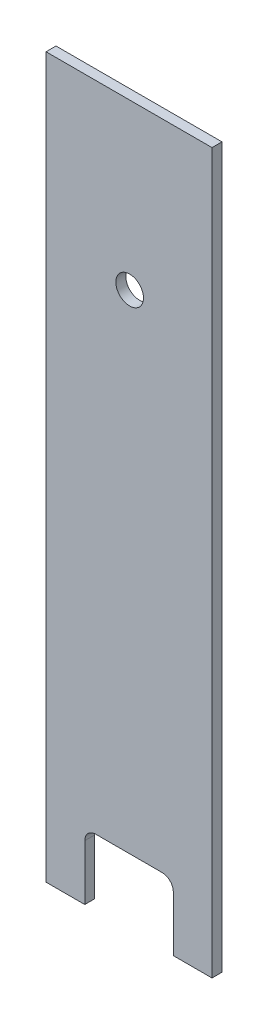
ISO-10303-21;
HEADER;
FILE_DESCRIPTION(('STEP AP214'),'2;1');
FILE_NAME('part.step','',(''),(''),'','','');
FILE_SCHEMA(('AUTOMOTIVE_DESIGN { 1 0 10303 214 1 1 1 1 }'));
ENDSEC;
DATA;
#1=APPLICATION_CONTEXT('core data for automotive mechanical design processes');
#2=APPLICATION_PROTOCOL_DEFINITION('international standard','automotive_design',2000,#1);
#3=PRODUCT_CONTEXT('',#1,'mechanical');
#4=PRODUCT('Part','Part','',(#3));
#5=PRODUCT_RELATED_PRODUCT_CATEGORY('part','',(#4));
#6=PRODUCT_DEFINITION_FORMATION('','',#4);
#7=PRODUCT_DEFINITION_CONTEXT('part definition',#1,'design');
#8=PRODUCT_DEFINITION('design','',#6,#7);
#9=PRODUCT_DEFINITION_SHAPE('','',#8);
#10=(LENGTH_UNIT() NAMED_UNIT(*) SI_UNIT(.MILLI.,.METRE.));
#11=(NAMED_UNIT(*) PLANE_ANGLE_UNIT() SI_UNIT($,.RADIAN.));
#12=(NAMED_UNIT(*) SI_UNIT($,.STERADIAN.) SOLID_ANGLE_UNIT());
#13=UNCERTAINTY_MEASURE_WITH_UNIT(LENGTH_MEASURE(1.E-05),#10,'distance_accuracy_value','');
#14=(GEOMETRIC_REPRESENTATION_CONTEXT(3) GLOBAL_UNCERTAINTY_ASSIGNED_CONTEXT((#13)) GLOBAL_UNIT_ASSIGNED_CONTEXT((#10,
#11,#12)) REPRESENTATION_CONTEXT('',''));
#15=CARTESIAN_POINT('',(0.,0.,0.));
#16=DIRECTION('',(0.,0.,1.));
#17=DIRECTION('',(1.,0.,0.));
#18=AXIS2_PLACEMENT_3D('',#15,#16,#17);
#19=CARTESIAN_POINT('',(-26.6321734476733,-106.380470016207,1.8));
#20=DIRECTION('',(0.,1.,0.));
#21=DIRECTION('',(0.,0.,1.));
#22=AXIS2_PLACEMENT_3D('',#19,#20,#21);
#23=PLANE('',#22);
#24=DIRECTION('',(1.,0.,0.));
#25=VECTOR('',#24,1.);
#26=CARTESIAN_POINT('',(-26.6321734476733,-106.380470016207,0.));
#27=LINE('',#26,#25);
#28=CARTESIAN_POINT('',(-26.6321734476733,-106.380470016207,0.));
#29=VERTEX_POINT('',#28);
#30=CARTESIAN_POINT('',(-19.6321734476733,-106.380470016207,0.));
#31=VERTEX_POINT('',#30);
#32=EDGE_CURVE('E189',#29,#31,#27,.T.);
#33=ORIENTED_EDGE('',*,*,#32,.T.);
#34=DIRECTION('',(0.,0.,-1.));
#35=VECTOR('',#34,1.);
#36=CARTESIAN_POINT('',(-19.6321734476733,-106.380470016207,10.2));
#37=LINE('',#36,#35);
#38=CARTESIAN_POINT('',(-19.6321734476733,-106.380470016207,1.8));
#39=VERTEX_POINT('',#38);
#40=EDGE_CURVE('E156',#39,#31,#37,.T.);
#41=ORIENTED_EDGE('',*,*,#40,.F.);
#42=DIRECTION('',(1.,0.,0.));
#43=VECTOR('',#42,1.);
#44=CARTESIAN_POINT('',(-26.6321734476733,-106.380470016207,1.8));
#45=LINE('',#44,#43);
#46=CARTESIAN_POINT('',(-26.6321734476733,-106.380470016207,1.8));
#47=VERTEX_POINT('',#46);
#48=EDGE_CURVE('E88',#47,#39,#45,.T.);
#49=ORIENTED_EDGE('',*,*,#48,.F.);
#50=DIRECTION('',(0.,0.,-1.));
#51=VECTOR('',#50,1.);
#52=CARTESIAN_POINT('',(-26.6321734476733,-106.380470016207,1.8));
#53=LINE('',#52,#51);
#54=EDGE_CURVE('E11',#47,#29,#53,.T.);
#55=ORIENTED_EDGE('',*,*,#54,.T.);
#56=EDGE_LOOP('',(#33,#41,#49,#55));
#57=FACE_BOUND('',#56,.T.);
#58=ADVANCED_FACE('F36',(#57),#23,.F.);
#59=CARTESIAN_POINT('',(-26.6321734476733,23.6195299837925,1.8));
#60=DIRECTION('',(1.,0.,0.));
#61=DIRECTION('',(0.,0.,-1.));
#62=AXIS2_PLACEMENT_3D('',#59,#60,#61);
#63=PLANE('',#62);
#64=DIRECTION('',(0.,-1.,0.));
#65=VECTOR('',#64,1.);
#66=CARTESIAN_POINT('',(-26.6321734476733,23.6195299837925,0.));
#67=LINE('',#66,#65);
#68=CARTESIAN_POINT('',(-26.6321734476733,23.6195299837925,0.));
#69=VERTEX_POINT('',#68);
#70=EDGE_CURVE('E177',#69,#29,#67,.T.);
#71=ORIENTED_EDGE('',*,*,#70,.T.);
#72=ORIENTED_EDGE('',*,*,#54,.F.);
#73=DIRECTION('',(0.,-1.,0.));
#74=VECTOR('',#73,1.);
#75=CARTESIAN_POINT('',(-26.6321734476733,23.6195299837925,1.8));
#76=LINE('',#75,#74);
#77=CARTESIAN_POINT('',(-26.6321734476733,23.6195299837925,1.8));
#78=VERTEX_POINT('',#77);
#79=EDGE_CURVE('E178',#78,#47,#76,.T.);
#80=ORIENTED_EDGE('',*,*,#79,.F.);
#81=DIRECTION('',(0.,0.,-1.));
#82=VECTOR('',#81,1.);
#83=CARTESIAN_POINT('',(-26.6321734476733,23.6195299837925,1.8));
#84=LINE('',#83,#82);
#85=EDGE_CURVE('E185',#78,#69,#84,.T.);
#86=ORIENTED_EDGE('',*,*,#85,.T.);
#87=EDGE_LOOP('',(#71,#72,#80,#86));
#88=FACE_BOUND('',#87,.T.);
#89=ADVANCED_FACE('F38',(#88),#63,.F.);
#90=CARTESIAN_POINT('',(-3.6321734476733,-106.380470016207,1.8));
#91=VERTEX_POINT('',#90);
#92=CARTESIAN_POINT('',(3.3678265523267,-106.380470016207,1.8));
#93=VERTEX_POINT('',#92);
#94=EDGE_CURVE('E180',#91,#93,#45,.T.);
#95=ORIENTED_EDGE('',*,*,#94,.F.);
#96=DIRECTION('',(0.,0.,-1.));
#97=VECTOR('',#96,1.);
#98=CARTESIAN_POINT('',(-3.6321734476733,-106.380470016207,10.2));
#99=LINE('',#98,#97);
#100=CARTESIAN_POINT('',(-3.6321734476733,-106.380470016207,0.));
#101=VERTEX_POINT('',#100);
#102=EDGE_CURVE('E158',#91,#101,#99,.T.);
#103=ORIENTED_EDGE('',*,*,#102,.T.);
#104=CARTESIAN_POINT('',(3.3678265523267,-106.380470016207,0.));
#105=VERTEX_POINT('',#104);
#106=EDGE_CURVE('E188',#101,#105,#27,.T.);
#107=ORIENTED_EDGE('',*,*,#106,.T.);
#108=DIRECTION('',(0.,0.,-1.));
#109=VECTOR('',#108,1.);
#110=CARTESIAN_POINT('',(3.3678265523267,-106.380470016207,1.8));
#111=LINE('',#110,#109);
#112=EDGE_CURVE('E44',#93,#105,#111,.T.);
#113=ORIENTED_EDGE('',*,*,#112,.F.);
#114=EDGE_LOOP('',(#95,#103,#107,#113));
#115=FACE_BOUND('',#114,.T.);
#116=ADVANCED_FACE('F220',(#115),#23,.F.);
#117=CARTESIAN_POINT('',(3.3678265523267,23.6195299837925,1.8));
#118=DIRECTION('',(-1.,0.,0.));
#119=DIRECTION('',(0.,0.,1.));
#120=AXIS2_PLACEMENT_3D('',#117,#118,#119);
#121=PLANE('',#120);
#122=DIRECTION('',(0.,1.,0.));
#123=VECTOR('',#122,1.);
#124=CARTESIAN_POINT('',(3.3678265523267,23.6195299837925,0.));
#125=LINE('',#124,#123);
#126=CARTESIAN_POINT('',(3.3678265523267,23.6195299837925,0.));
#127=VERTEX_POINT('',#126);
#128=EDGE_CURVE('E192',#105,#127,#125,.T.);
#129=ORIENTED_EDGE('',*,*,#128,.T.);
#130=DIRECTION('',(0.,0.,-1.));
#131=VECTOR('',#130,1.);
#132=CARTESIAN_POINT('',(3.3678265523267,23.6195299837925,1.8));
#133=LINE('',#132,#131);
#134=CARTESIAN_POINT('',(3.3678265523267,23.6195299837925,1.8));
#135=VERTEX_POINT('',#134);
#136=EDGE_CURVE('E196',#135,#127,#133,.T.);
#137=ORIENTED_EDGE('',*,*,#136,.F.);
#138=DIRECTION('',(0.,1.,0.));
#139=VECTOR('',#138,1.);
#140=CARTESIAN_POINT('',(3.3678265523267,23.6195299837925,1.8));
#141=LINE('',#140,#139);
#142=EDGE_CURVE('E182',#93,#135,#141,.T.);
#143=ORIENTED_EDGE('',*,*,#142,.F.);
#144=ORIENTED_EDGE('',*,*,#112,.T.);
#145=EDGE_LOOP('',(#129,#137,#143,#144));
#146=FACE_BOUND('',#145,.T.);
#147=ADVANCED_FACE('F202',(#146),#121,.F.);
#148=CARTESIAN_POINT('',(-26.6321734476733,23.6195299837925,1.8));
#149=DIRECTION('',(0.,-1.,0.));
#150=DIRECTION('',(0.,0.,-1.));
#151=AXIS2_PLACEMENT_3D('',#148,#149,#150);
#152=PLANE('',#151);
#153=DIRECTION('',(-1.,0.,0.));
#154=VECTOR('',#153,1.);
#155=CARTESIAN_POINT('',(-26.6321734476733,23.6195299837925,0.));
#156=LINE('',#155,#154);
#157=EDGE_CURVE('E81',#127,#69,#156,.T.);
#158=ORIENTED_EDGE('',*,*,#157,.T.);
#159=ORIENTED_EDGE('',*,*,#85,.F.);
#160=DIRECTION('',(-1.,0.,0.));
#161=VECTOR('',#160,1.);
#162=CARTESIAN_POINT('',(-26.6321734476733,23.6195299837925,1.8));
#163=LINE('',#162,#161);
#164=EDGE_CURVE('E60',#135,#78,#163,.T.);
#165=ORIENTED_EDGE('',*,*,#164,.F.);
#166=ORIENTED_EDGE('',*,*,#136,.T.);
#167=EDGE_LOOP('',(#158,#159,#165,#166));
#168=FACE_BOUND('',#167,.T.);
#169=ADVANCED_FACE('F211',(#168),#152,.F.);
#170=CARTESIAN_POINT('',(0.,0.,1.8));
#171=DIRECTION('',(0.,0.,1.));
#172=DIRECTION('',(1.,0.,0.));
#173=AXIS2_PLACEMENT_3D('',#170,#171,#172);
#174=PLANE('',#173);
#175=DIRECTION('',(0.,-1.,0.));
#176=VECTOR('',#175,1.);
#177=CARTESIAN_POINT('',(-19.6321734476733,0.,1.8));
#178=LINE('',#177,#176);
#179=CARTESIAN_POINT('',(-19.6321734476733,-96.3804700162075,1.8));
#180=VERTEX_POINT('',#179);
#181=EDGE_CURVE('E167',#180,#39,#178,.T.);
#182=ORIENTED_EDGE('',*,*,#181,.F.);
#183=CARTESIAN_POINT('',(-17.6321734476733,-96.3804700162074,1.8));
#184=DIRECTION('',(0.,0.,1.));
#185=DIRECTION('',(1.,0.,0.));
#186=AXIS2_PLACEMENT_3D('',#183,#184,#185);
#187=CIRCLE('',#186,2.);
#188=CARTESIAN_POINT('',(-17.6321734476733,-94.3804700162074,1.8));
#189=VERTEX_POINT('',#188);
#190=EDGE_CURVE('E169',#189,#180,#187,.T.);
#191=ORIENTED_EDGE('',*,*,#190,.F.);
#192=DIRECTION('',(-1.,0.,0.));
#193=VECTOR('',#192,1.);
#194=CARTESIAN_POINT('',(0.,-94.3804700162074,1.8));
#195=LINE('',#194,#193);
#196=CARTESIAN_POINT('',(-5.63217344767331,-94.3804700162074,1.8));
#197=VERTEX_POINT('',#196);
#198=EDGE_CURVE('E155',#197,#189,#195,.T.);
#199=ORIENTED_EDGE('',*,*,#198,.F.);
#200=CARTESIAN_POINT('',(-5.6321734476733,-96.3804700162074,1.8));
#201=DIRECTION('',(0.,0.,1.));
#202=DIRECTION('',(1.,0.,0.));
#203=AXIS2_PLACEMENT_3D('',#200,#201,#202);
#204=CIRCLE('',#203,2.);
#205=CARTESIAN_POINT('',(-3.6321734476733,-96.3804700162075,1.8));
#206=VERTEX_POINT('',#205);
#207=EDGE_CURVE('E132',#206,#197,#204,.T.);
#208=ORIENTED_EDGE('',*,*,#207,.F.);
#209=DIRECTION('',(0.,1.,0.));
#210=VECTOR('',#209,1.);
#211=CARTESIAN_POINT('',(-3.6321734476733,0.,1.8));
#212=LINE('',#211,#210);
#213=EDGE_CURVE('E165',#91,#206,#212,.T.);
#214=ORIENTED_EDGE('',*,*,#213,.F.);
#215=ORIENTED_EDGE('',*,*,#94,.T.);
#216=ORIENTED_EDGE('',*,*,#142,.T.);
#217=ORIENTED_EDGE('',*,*,#164,.T.);
#218=ORIENTED_EDGE('',*,*,#79,.T.);
#219=ORIENTED_EDGE('',*,*,#48,.T.);
#220=EDGE_LOOP('',(#182,#191,#199,#208,#214,#215,#216,#217,#218,#219));
#221=FACE_BOUND('',#220,.T.);
#222=CARTESIAN_POINT('',(-11.5176619183295,-6.12639899624767,1.8));
#223=DIRECTION('',(0.,0.,1.));
#224=DIRECTION('',(1.,0.,0.));
#225=AXIS2_PLACEMENT_3D('',#222,#223,#224);
#226=CIRCLE('',#225,2.5);
#227=CARTESIAN_POINT('',(-9.01766191832948,-6.12639899624767,1.8));
#228=VERTEX_POINT('',#227);
#229=EDGE_CURVE('E174',#228,#228,#226,.T.);
#230=ORIENTED_EDGE('',*,*,#229,.F.);
#231=EDGE_LOOP('',(#230));
#232=FACE_BOUND('',#231,.T.);
#233=ADVANCED_FACE('F213',(#221,#232),#174,.T.);
#234=CARTESIAN_POINT('',(0.,0.,0.));
#235=DIRECTION('',(0.,0.,1.));
#236=DIRECTION('',(1.,0.,0.));
#237=AXIS2_PLACEMENT_3D('',#234,#235,#236);
#238=PLANE('',#237);
#239=CARTESIAN_POINT('',(-11.5176619183295,-6.12639899624767,0.));
#240=DIRECTION('',(0.,0.,-1.));
#241=DIRECTION('',(-1.,0.,0.));
#242=AXIS2_PLACEMENT_3D('',#239,#240,#241);
#243=CIRCLE('',#242,2.5);
#244=CARTESIAN_POINT('',(-14.0176619183295,-6.12639899624767,0.));
#245=VERTEX_POINT('',#244);
#246=EDGE_CURVE('E171',#245,#245,#243,.T.);
#247=ORIENTED_EDGE('',*,*,#246,.F.);
#248=EDGE_LOOP('',(#247));
#249=FACE_BOUND('',#248,.T.);
#250=CARTESIAN_POINT('',(-17.6321734476733,-96.3804700162074,0.));
#251=DIRECTION('',(0.,0.,-1.));
#252=DIRECTION('',(1.,0.,0.));
#253=AXIS2_PLACEMENT_3D('',#250,#251,#252);
#254=CIRCLE('',#253,2.);
#255=CARTESIAN_POINT('',(-19.6321734476733,-96.3804700162075,0.));
#256=VERTEX_POINT('',#255);
#257=CARTESIAN_POINT('',(-17.6321734476733,-94.3804700162074,0.));
#258=VERTEX_POINT('',#257);
#259=EDGE_CURVE('E51',#256,#258,#254,.T.);
#260=ORIENTED_EDGE('',*,*,#259,.F.);
#261=DIRECTION('',(0.,1.,0.));
#262=VECTOR('',#261,1.);
#263=CARTESIAN_POINT('',(-19.6321734476733,-106.380470016207,0.));
#264=LINE('',#263,#262);
#265=EDGE_CURVE('E147',#31,#256,#264,.T.);
#266=ORIENTED_EDGE('',*,*,#265,.F.);
#267=ORIENTED_EDGE('',*,*,#32,.F.);
#268=ORIENTED_EDGE('',*,*,#70,.F.);
#269=ORIENTED_EDGE('',*,*,#157,.F.);
#270=ORIENTED_EDGE('',*,*,#128,.F.);
#271=ORIENTED_EDGE('',*,*,#106,.F.);
#272=DIRECTION('',(0.,-1.,0.));
#273=VECTOR('',#272,1.);
#274=CARTESIAN_POINT('',(-3.6321734476733,-96.3804700162075,0.));
#275=LINE('',#274,#273);
#276=CARTESIAN_POINT('',(-3.6321734476733,-96.3804700162075,0.));
#277=VERTEX_POINT('',#276);
#278=EDGE_CURVE('E145',#277,#101,#275,.T.);
#279=ORIENTED_EDGE('',*,*,#278,.F.);
#280=CARTESIAN_POINT('',(-5.6321734476733,-96.3804700162074,0.));
#281=DIRECTION('',(0.,0.,-1.));
#282=DIRECTION('',(-1.,0.,0.));
#283=AXIS2_PLACEMENT_3D('',#280,#281,#282);
#284=CIRCLE('',#283,2.);
#285=CARTESIAN_POINT('',(-5.63217344767331,-94.3804700162074,0.));
#286=VERTEX_POINT('',#285);
#287=EDGE_CURVE('E129',#286,#277,#284,.T.);
#288=ORIENTED_EDGE('',*,*,#287,.F.);
#289=DIRECTION('',(1.,0.,0.));
#290=VECTOR('',#289,1.);
#291=CARTESIAN_POINT('',(-17.6321734476733,-94.3804700162074,0.));
#292=LINE('',#291,#290);
#293=EDGE_CURVE('E139',#258,#286,#292,.T.);
#294=ORIENTED_EDGE('',*,*,#293,.F.);
#295=EDGE_LOOP('',(#260,#266,#267,#268,#269,#270,#271,#279,#288,#294));
#296=FACE_BOUND('',#295,.T.);
#297=ADVANCED_FACE('F143',(#249,#296),#238,.F.);
#298=CARTESIAN_POINT('',(-11.5176619183295,-6.12639899624767,10.));
#299=DIRECTION('',(0.,0.,-1.));
#300=DIRECTION('',(-1.,0.,0.));
#301=AXIS2_PLACEMENT_3D('',#298,#299,#300);
#302=CYLINDRICAL_SURFACE('',#301,2.5);
#303=ORIENTED_EDGE('',*,*,#229,.T.);
#304=EDGE_LOOP('',(#303));
#305=FACE_BOUND('',#304,.T.);
#306=ORIENTED_EDGE('',*,*,#246,.T.);
#307=EDGE_LOOP('',(#306));
#308=FACE_BOUND('',#307,.T.);
#309=ADVANCED_FACE('F251',(#305,#308),#302,.F.);
#310=CARTESIAN_POINT('',(-17.6321734476733,-96.3804700162074,10.2));
#311=DIRECTION('',(0.,0.,-1.));
#312=DIRECTION('',(-1.,0.,0.));
#313=AXIS2_PLACEMENT_3D('',#310,#311,#312);
#314=CYLINDRICAL_SURFACE('',#313,2.);
#315=ORIENTED_EDGE('',*,*,#190,.T.);
#316=DIRECTION('',(0.,0.,-1.));
#317=VECTOR('',#316,1.);
#318=CARTESIAN_POINT('',(-19.6321734476733,-96.3804700162075,10.2));
#319=LINE('',#318,#317);
#320=EDGE_CURVE('E153',#180,#256,#319,.T.);
#321=ORIENTED_EDGE('',*,*,#320,.T.);
#322=ORIENTED_EDGE('',*,*,#259,.T.);
#323=DIRECTION('',(0.,0.,-1.));
#324=VECTOR('',#323,1.);
#325=CARTESIAN_POINT('',(-17.6321734476733,-94.3804700162074,10.2));
#326=LINE('',#325,#324);
#327=EDGE_CURVE('E136',#189,#258,#326,.T.);
#328=ORIENTED_EDGE('',*,*,#327,.F.);
#329=EDGE_LOOP('',(#315,#321,#322,#328));
#330=FACE_BOUND('',#329,.T.);
#331=ADVANCED_FACE('F243',(#330),#314,.F.);
#332=CARTESIAN_POINT('',(-19.6321734476733,-106.380470016207,10.2));
#333=DIRECTION('',(-1.,0.,0.));
#334=DIRECTION('',(0.,0.,1.));
#335=AXIS2_PLACEMENT_3D('',#332,#333,#334);
#336=PLANE('',#335);
#337=ORIENTED_EDGE('',*,*,#181,.T.);
#338=ORIENTED_EDGE('',*,*,#40,.T.);
#339=ORIENTED_EDGE('',*,*,#265,.T.);
#340=ORIENTED_EDGE('',*,*,#320,.F.);
#341=EDGE_LOOP('',(#337,#338,#339,#340));
#342=FACE_BOUND('',#341,.T.);
#343=ADVANCED_FACE('F236',(#342),#336,.F.);
#344=CARTESIAN_POINT('',(-3.6321734476733,-96.3804700162075,10.2));
#345=DIRECTION('',(1.,0.,0.));
#346=DIRECTION('',(0.,0.,-1.));
#347=AXIS2_PLACEMENT_3D('',#344,#345,#346);
#348=PLANE('',#347);
#349=ORIENTED_EDGE('',*,*,#213,.T.);
#350=DIRECTION('',(0.,0.,-1.));
#351=VECTOR('',#350,1.);
#352=CARTESIAN_POINT('',(-3.6321734476733,-96.3804700162075,10.2));
#353=LINE('',#352,#351);
#354=EDGE_CURVE('E135',#206,#277,#353,.T.);
#355=ORIENTED_EDGE('',*,*,#354,.T.);
#356=ORIENTED_EDGE('',*,*,#278,.T.);
#357=ORIENTED_EDGE('',*,*,#102,.F.);
#358=EDGE_LOOP('',(#349,#355,#356,#357));
#359=FACE_BOUND('',#358,.T.);
#360=ADVANCED_FACE('F234',(#359),#348,.F.);
#361=CARTESIAN_POINT('',(-5.6321734476733,-96.3804700162074,10.2));
#362=DIRECTION('',(0.,0.,-1.));
#363=DIRECTION('',(-1.,0.,0.));
#364=AXIS2_PLACEMENT_3D('',#361,#362,#363);
#365=CYLINDRICAL_SURFACE('',#364,2.);
#366=ORIENTED_EDGE('',*,*,#207,.T.);
#367=DIRECTION('',(0.,0.,-1.));
#368=VECTOR('',#367,1.);
#369=CARTESIAN_POINT('',(-5.63217344767331,-94.3804700162074,10.2));
#370=LINE('',#369,#368);
#371=EDGE_CURVE('E124',#197,#286,#370,.T.);
#372=ORIENTED_EDGE('',*,*,#371,.T.);
#373=ORIENTED_EDGE('',*,*,#287,.T.);
#374=ORIENTED_EDGE('',*,*,#354,.F.);
#375=EDGE_LOOP('',(#366,#372,#373,#374));
#376=FACE_BOUND('',#375,.T.);
#377=ADVANCED_FACE('F126',(#376),#365,.F.);
#378=CARTESIAN_POINT('',(-17.6321734476733,-94.3804700162074,10.2));
#379=DIRECTION('',(0.,1.,0.));
#380=DIRECTION('',(0.,0.,1.));
#381=AXIS2_PLACEMENT_3D('',#378,#379,#380);
#382=PLANE('',#381);
#383=ORIENTED_EDGE('',*,*,#198,.T.);
#384=ORIENTED_EDGE('',*,*,#327,.T.);
#385=ORIENTED_EDGE('',*,*,#293,.T.);
#386=ORIENTED_EDGE('',*,*,#371,.F.);
#387=EDGE_LOOP('',(#383,#384,#385,#386));
#388=FACE_BOUND('',#387,.T.);
#389=ADVANCED_FACE('F140',(#388),#382,.F.);
#390=CLOSED_SHELL('',(#58,#89,#116,#147,#169,#233,#297,#309,#331,#343,#360,#377,#389));
#391=MANIFOLD_SOLID_BREP('B2',#390);
#392=ADVANCED_BREP_SHAPE_REPRESENTATION('',(#18,#391),#14);
#393=SHAPE_DEFINITION_REPRESENTATION(#9,#392);
ENDSEC;
END-ISO-10303-21;
